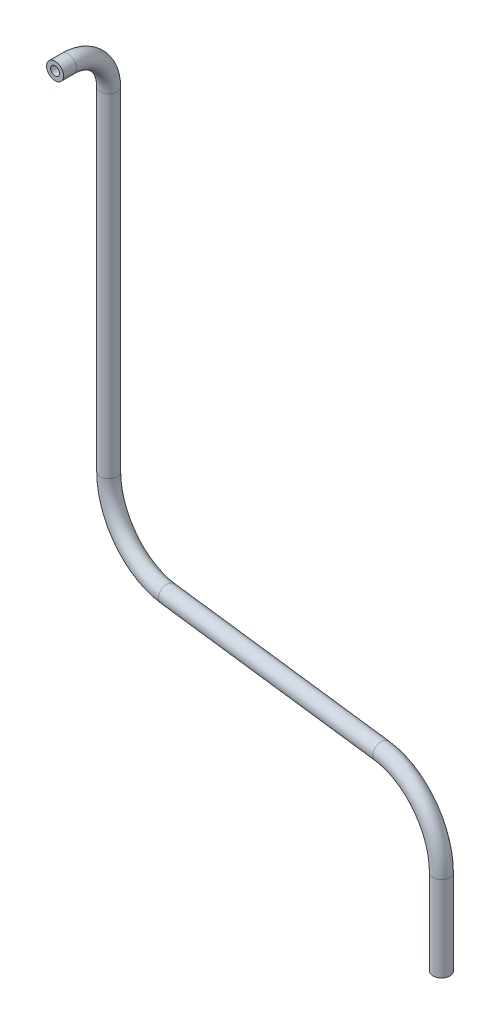
ISO-10303-21;
HEADER;
FILE_DESCRIPTION(('STEP AP214'),'2;1');
FILE_NAME('part.step','',(''),(''),'','','');
FILE_SCHEMA(('AUTOMOTIVE_DESIGN { 1 0 10303 214 1 1 1 1 }'));
ENDSEC;
DATA;
#1=APPLICATION_CONTEXT('core data for automotive mechanical design processes');
#2=APPLICATION_PROTOCOL_DEFINITION('international standard','automotive_design',2000,#1);
#3=PRODUCT_CONTEXT('',#1,'mechanical');
#4=PRODUCT('Part','Part','',(#3));
#5=PRODUCT_RELATED_PRODUCT_CATEGORY('part','',(#4));
#6=PRODUCT_DEFINITION_FORMATION('','',#4);
#7=PRODUCT_DEFINITION_CONTEXT('part definition',#1,'design');
#8=PRODUCT_DEFINITION('design','',#6,#7);
#9=PRODUCT_DEFINITION_SHAPE('','',#8);
#10=(LENGTH_UNIT() NAMED_UNIT(*) SI_UNIT(.MILLI.,.METRE.));
#11=(NAMED_UNIT(*) PLANE_ANGLE_UNIT() SI_UNIT($,.RADIAN.));
#12=(NAMED_UNIT(*) SI_UNIT($,.STERADIAN.) SOLID_ANGLE_UNIT());
#13=UNCERTAINTY_MEASURE_WITH_UNIT(LENGTH_MEASURE(1.E-05),#10,'distance_accuracy_value','');
#14=(GEOMETRIC_REPRESENTATION_CONTEXT(3) GLOBAL_UNCERTAINTY_ASSIGNED_CONTEXT((#13)) GLOBAL_UNIT_ASSIGNED_CONTEXT((#10,
#11,#12)) REPRESENTATION_CONTEXT('',''));
#15=CARTESIAN_POINT('',(0.,0.,0.));
#16=DIRECTION('',(0.,0.,1.));
#17=DIRECTION('',(1.,0.,0.));
#18=AXIS2_PLACEMENT_3D('',#15,#16,#17);
#19=CARTESIAN_POINT('',(-176.747376490412,-32.6055777684496,84.0470488537616));
#20=DIRECTION('',(0.,1.,0.));
#21=DIRECTION('',(0.,0.,1.));
#22=AXIS2_PLACEMENT_3D('',#19,#20,#21);
#23=CYLINDRICAL_SURFACE('',#22,3.175);
#24=CARTESIAN_POINT('',(-176.747376490412,-0.667291642099263,84.0470488537616));
#25=DIRECTION('',(0.,1.,0.));
#26=DIRECTION('',(0.,0.,1.));
#27=AXIS2_PLACEMENT_3D('',#24,#25,#26);
#28=CIRCLE('',#27,3.175);
#29=CARTESIAN_POINT('',(-173.594970054303,-0.667291642099263,84.4251475995619));
#30=VERTEX_POINT('',#29);
#31=EDGE_CURVE('E56',#30,#30,#28,.T.);
#32=ORIENTED_EDGE('',*,*,#31,.F.);
#33=EDGE_LOOP('',(#32));
#34=FACE_BOUND('',#33,.T.);
#35=CARTESIAN_POINT('',(-176.747376490412,-32.6055777684496,84.0470488537616));
#36=DIRECTION('',(0.,1.,0.));
#37=DIRECTION('',(0.,0.,1.));
#38=AXIS2_PLACEMENT_3D('',#35,#36,#37);
#39=CIRCLE('',#38,3.175);
#40=CARTESIAN_POINT('',(-176.747376490412,-32.6055777684496,87.2220488537616));
#41=VERTEX_POINT('',#40);
#42=EDGE_CURVE('E53',#41,#41,#39,.T.);
#43=ORIENTED_EDGE('',*,*,#42,.T.);
#44=EDGE_LOOP('',(#43));
#45=FACE_BOUND('',#44,.T.);
#46=ADVANCED_FACE('F32',(#34,#45),#23,.T.);
#47=CARTESIAN_POINT('',(-201.966627979288,-0.667291642099263,81.0222588873598));
#48=DIRECTION('',(-0.119086219149678,0.,0.992883916884867));
#49=DIRECTION('',(0.992883916884867,0.,0.119086219149678));
#50=AXIS2_PLACEMENT_3D('',#47,#48,#49);
#51=TOROIDAL_SURFACE('',#50,25.4,3.175);
#52=CARTESIAN_POINT('',(-201.966627979288,24.7327083579008,81.0222588873598));
#53=DIRECTION('',(-0.992883916884867,0.,-0.119086219149678));
#54=DIRECTION('',(-0.118238791716342,0.119086219149678,0.985818472408635));
#55=AXIS2_PLACEMENT_3D('',#52,#53,#54);
#56=CIRCLE('',#55,3.175);
#57=CARTESIAN_POINT('',(-201.966627979288,27.9077083579007,81.0222588873598));
#58=VERTEX_POINT('',#57);
#59=EDGE_CURVE('E59',#58,#58,#56,.T.);
#60=CARTESIAN_POINT('',(-201.966627979288,-0.667291642099263,81.0222588873598));
#61=DIRECTION('',(-0.119086219149678,0.,0.992883916884867));
#62=DIRECTION('',(0.992883916884867,0.,0.119086219149678));
#63=AXIS2_PLACEMENT_3D('',#60,#61,#62);
#64=CIRCLE('',#63,28.575);
#65=EDGE_CURVE('',#30,#58,#64,.T.);
#66=ORIENTED_EDGE('',*,*,#31,.T.);
#67=ORIENTED_EDGE('',*,*,#59,.F.);
#68=ORIENTED_EDGE('',*,*,#65,.T.);
#69=ORIENTED_EDGE('',*,*,#65,.F.);
#70=EDGE_LOOP('',(#66,#68,#67,#69));
#71=FACE_BOUND('',#70,.T.);
#72=ADVANCED_FACE('F110',(#71),#51,.T.);
#73=CARTESIAN_POINT('',(-201.966627979288,24.7327083579008,81.0222588873598));
#74=DIRECTION('',(-0.992883916884867,0.,-0.119086219149678));
#75=DIRECTION('',(-0.119086219149678,0.,0.992883916884867));
#76=AXIS2_PLACEMENT_3D('',#73,#74,#75);
#77=CYLINDRICAL_SURFACE('',#76,3.175);
#78=CARTESIAN_POINT('',(-293.244125001536,24.7327083579007,70.0744614369495));
#79=DIRECTION('',(-0.992883916884867,0.,-0.119086219149678));
#80=DIRECTION('',(-0.118238791716342,0.119086219149678,0.985818472408635));
#81=AXIS2_PLACEMENT_3D('',#78,#79,#80);
#82=CIRCLE('',#81,3.175);
#83=CARTESIAN_POINT('',(-293.244125001536,21.5577083579007,70.0744614369495));
#84=VERTEX_POINT('',#83);
#85=EDGE_CURVE('E62',#84,#84,#82,.T.);
#86=ORIENTED_EDGE('',*,*,#85,.F.);
#87=EDGE_LOOP('',(#86));
#88=FACE_BOUND('',#87,.T.);
#89=ORIENTED_EDGE('',*,*,#59,.T.);
#90=EDGE_LOOP('',(#89));
#91=FACE_BOUND('',#90,.T.);
#92=ADVANCED_FACE('F114',(#88,#91),#77,.T.);
#93=CARTESIAN_POINT('',(-293.244125001536,50.1327083579007,70.0744614369496));
#94=DIRECTION('',(0.119086219149678,0.,-0.992883916884867));
#95=DIRECTION('',(-0.992883916884867,0.,-0.119086219149678));
#96=AXIS2_PLACEMENT_3D('',#93,#94,#95);
#97=TOROIDAL_SURFACE('',#96,25.4,3.175);
#98=CARTESIAN_POINT('',(-318.463376490412,50.1327083579008,67.0496714705474));
#99=DIRECTION('',(0.,1.,0.));
#100=DIRECTION('',(0.,0.,1.));
#101=AXIS2_PLACEMENT_3D('',#98,#99,#100);
#102=CIRCLE('',#101,3.175);
#103=CARTESIAN_POINT('',(-321.615782926521,50.1327083579008,66.6715727247472));
#104=VERTEX_POINT('',#103);
#105=EDGE_CURVE('E65',#104,#104,#102,.T.);
#106=CARTESIAN_POINT('',(-293.244125001536,50.1327083579007,70.0744614369496));
#107=DIRECTION('',(0.119086219149678,0.,-0.992883916884867));
#108=DIRECTION('',(-0.992883916884867,0.,-0.119086219149678));
#109=AXIS2_PLACEMENT_3D('',#106,#107,#108);
#110=CIRCLE('',#109,28.575);
#111=EDGE_CURVE('',#84,#104,#110,.T.);
#112=ORIENTED_EDGE('',*,*,#85,.T.);
#113=ORIENTED_EDGE('',*,*,#105,.F.);
#114=ORIENTED_EDGE('',*,*,#111,.T.);
#115=ORIENTED_EDGE('',*,*,#111,.F.);
#116=EDGE_LOOP('',(#112,#114,#113,#115));
#117=FACE_BOUND('',#116,.T.);
#118=ADVANCED_FACE('F84',(#117),#97,.T.);
#119=CARTESIAN_POINT('',(-318.463376490412,50.1327083579009,67.0496714705474));
#120=DIRECTION('',(0.,1.,0.));
#121=DIRECTION('',(-1.,0.,0.));
#122=AXIS2_PLACEMENT_3D('',#119,#120,#121);
#123=CYLINDRICAL_SURFACE('',#122,3.175);
#124=CARTESIAN_POINT('',(-318.463376490412,175.03642223155,67.0496714705474));
#125=DIRECTION('',(0.,1.,0.));
#126=DIRECTION('',(0.,0.,1.));
#127=AXIS2_PLACEMENT_3D('',#124,#125,#126);
#128=CIRCLE('',#127,3.175);
#129=CARTESIAN_POINT('',(-318.463376490412,175.03642223155,63.8746714705474));
#130=VERTEX_POINT('',#129);
#131=EDGE_CURVE('E67',#130,#130,#128,.T.);
#132=ORIENTED_EDGE('',*,*,#131,.F.);
#133=EDGE_LOOP('',(#132));
#134=FACE_BOUND('',#133,.T.);
#135=ORIENTED_EDGE('',*,*,#105,.T.);
#136=EDGE_LOOP('',(#135));
#137=FACE_BOUND('',#136,.T.);
#138=ADVANCED_FACE('F77',(#134,#137),#123,.T.);
#139=CARTESIAN_POINT('',(-318.463376490412,175.03642223155,82.2896714705478));
#140=DIRECTION('',(1.,0.,0.));
#141=DIRECTION('',(0.,0.,-1.));
#142=AXIS2_PLACEMENT_3D('',#139,#140,#141);
#143=TOROIDAL_SURFACE('',#142,15.2400000000004,3.175);
#144=CARTESIAN_POINT('',(-318.463376490412,190.27642223155,82.2896714705478));
#145=DIRECTION('',(0.,0.,1.));
#146=DIRECTION('',(0.,-1.,0.));
#147=AXIS2_PLACEMENT_3D('',#144,#145,#146);
#148=CIRCLE('',#147,3.175);
#149=CARTESIAN_POINT('',(-318.463376490412,193.451422231551,82.2896714705478));
#150=VERTEX_POINT('',#149);
#151=EDGE_CURVE('E36',#150,#150,#148,.T.);
#152=CARTESIAN_POINT('',(-318.463376490412,175.03642223155,82.2896714705478));
#153=DIRECTION('',(1.,0.,0.));
#154=DIRECTION('',(0.,0.,-1.));
#155=AXIS2_PLACEMENT_3D('',#152,#153,#154);
#156=CIRCLE('',#155,18.4150000000004);
#157=EDGE_CURVE('',#130,#150,#156,.T.);
#158=ORIENTED_EDGE('',*,*,#131,.T.);
#159=ORIENTED_EDGE('',*,*,#151,.F.);
#160=ORIENTED_EDGE('',*,*,#157,.T.);
#161=ORIENTED_EDGE('',*,*,#157,.F.);
#162=EDGE_LOOP('',(#158,#160,#159,#161));
#163=FACE_BOUND('',#162,.T.);
#164=ADVANCED_FACE('F75',(#163),#143,.T.);
#165=CARTESIAN_POINT('',(-318.463376490412,190.27642223155,82.2896714705478));
#166=DIRECTION('',(0.,0.,1.));
#167=DIRECTION('',(1.,0.,0.));
#168=AXIS2_PLACEMENT_3D('',#165,#166,#167);
#169=CYLINDRICAL_SURFACE('',#168,3.175);
#170=CARTESIAN_POINT('',(-318.463376490412,190.27642223155,87.1470488537625));
#171=DIRECTION('',(0.,0.,1.));
#172=DIRECTION('',(0.,-1.,0.));
#173=AXIS2_PLACEMENT_3D('',#170,#171,#172);
#174=CIRCLE('',#173,3.175);
#175=CARTESIAN_POINT('',(-318.463376490412,187.10142223155,87.1470488537625));
#176=VERTEX_POINT('',#175);
#177=EDGE_CURVE('E49',#176,#176,#174,.T.);
#178=ORIENTED_EDGE('',*,*,#177,.F.);
#179=EDGE_LOOP('',(#178));
#180=FACE_BOUND('',#179,.T.);
#181=ORIENTED_EDGE('',*,*,#151,.T.);
#182=EDGE_LOOP('',(#181));
#183=FACE_BOUND('',#182,.T.);
#184=ADVANCED_FACE('F34',(#180,#183),#169,.T.);
#185=CARTESIAN_POINT('',(-176.747376490412,-32.6055777684496,84.0470488537616));
#186=DIRECTION('',(0.,1.,0.));
#187=DIRECTION('',(0.,0.,1.));
#188=AXIS2_PLACEMENT_3D('',#185,#186,#187);
#189=PLANE('',#188);
#190=CARTESIAN_POINT('',(-176.747376490412,-32.6055777684496,84.0470488537616));
#191=DIRECTION('',(0.,1.,0.));
#192=DIRECTION('',(0.,0.,1.));
#193=AXIS2_PLACEMENT_3D('',#190,#191,#192);
#194=CIRCLE('',#193,1.67449763501505);
#195=CARTESIAN_POINT('',(-176.747376490412,-32.6055777684496,85.7215464887767));
#196=VERTEX_POINT('',#195);
#197=EDGE_CURVE('E52',#196,#196,#194,.F.);
#198=ORIENTED_EDGE('',*,*,#197,.F.);
#199=EDGE_LOOP('',(#198));
#200=FACE_BOUND('',#199,.T.);
#201=ORIENTED_EDGE('',*,*,#42,.F.);
#202=EDGE_LOOP('',(#201));
#203=FACE_BOUND('',#202,.T.);
#204=ADVANCED_FACE('F82',(#200,#203),#189,.F.);
#205=CARTESIAN_POINT('',(-318.463376490412,190.27642223155,87.1470488537625));
#206=DIRECTION('',(0.,0.,1.));
#207=DIRECTION('',(0.,-1.,0.));
#208=AXIS2_PLACEMENT_3D('',#205,#206,#207);
#209=PLANE('',#208);
#210=CARTESIAN_POINT('',(-318.463376490412,190.27642223155,87.1470488537625));
#211=DIRECTION('',(0.,0.,1.));
#212=DIRECTION('',(0.,-1.,0.));
#213=AXIS2_PLACEMENT_3D('',#210,#211,#212);
#214=CIRCLE('',#213,1.67449763501505);
#215=CARTESIAN_POINT('',(-318.463376490412,188.601924596535,87.1470488537625));
#216=VERTEX_POINT('',#215);
#217=EDGE_CURVE('E10',#216,#216,#214,.F.);
#218=ORIENTED_EDGE('',*,*,#217,.T.);
#219=EDGE_LOOP('',(#218));
#220=FACE_BOUND('',#219,.T.);
#221=ORIENTED_EDGE('',*,*,#177,.T.);
#222=EDGE_LOOP('',(#221));
#223=FACE_BOUND('',#222,.T.);
#224=ADVANCED_FACE('F101',(#220,#223),#209,.T.);
#225=CARTESIAN_POINT('',(-176.747376490412,-32.6055777684496,84.0470488537616));
#226=DIRECTION('',(0.,1.,0.));
#227=DIRECTION('',(0.,0.,1.));
#228=AXIS2_PLACEMENT_3D('',#225,#226,#227);
#229=CYLINDRICAL_SURFACE('',#228,1.67449763501505);
#230=CARTESIAN_POINT('',(-176.747376490412,-0.667291642099263,84.0470488537616));
#231=DIRECTION('',(0.,1.,0.));
#232=DIRECTION('',(0.,0.,1.));
#233=AXIS2_PLACEMENT_3D('',#230,#231,#232);
#234=CIRCLE('',#233,1.67449763501505);
#235=CARTESIAN_POINT('',(-175.084794719744,-0.667291642099263,84.2464584460906));
#236=VERTEX_POINT('',#235);
#237=EDGE_CURVE('E237',#236,#236,#234,.F.);
#238=ORIENTED_EDGE('',*,*,#237,.F.);
#239=EDGE_LOOP('',(#238));
#240=FACE_BOUND('',#239,.T.);
#241=ORIENTED_EDGE('',*,*,#197,.T.);
#242=EDGE_LOOP('',(#241));
#243=FACE_BOUND('',#242,.T.);
#244=ADVANCED_FACE('F104',(#240,#243),#229,.F.);
#245=CARTESIAN_POINT('',(-201.966627979288,-0.667291642099263,81.0222588873598));
#246=DIRECTION('',(-0.119086219149678,0.,0.992883916884867));
#247=DIRECTION('',(0.992883916884867,0.,0.119086219149678));
#248=AXIS2_PLACEMENT_3D('',#245,#246,#247);
#249=TOROIDAL_SURFACE('',#248,25.4,1.67449763501505);
#250=CARTESIAN_POINT('',(-201.966627979288,24.7327083579008,81.0222588873598));
#251=DIRECTION('',(-0.992883916884867,0.,-0.119086219149678));
#252=DIRECTION('',(-0.118238791716342,0.119086219149678,0.985818472408635));
#253=AXIS2_PLACEMENT_3D('',#250,#251,#252);
#254=CIRCLE('',#253,1.67449763501505);
#255=CARTESIAN_POINT('',(-201.966627979288,26.4072059929157,81.0222588873598));
#256=VERTEX_POINT('',#255);
#257=EDGE_CURVE('E232',#256,#256,#254,.F.);
#258=CARTESIAN_POINT('',(-201.966627979288,-0.667291642099263,81.0222588873598));
#259=DIRECTION('',(-0.119086219149678,0.,0.992883916884867));
#260=DIRECTION('',(0.992883916884867,0.,0.119086219149678));
#261=AXIS2_PLACEMENT_3D('',#258,#259,#260);
#262=CIRCLE('',#261,27.074497635015);
#263=EDGE_CURVE('',#236,#256,#262,.T.);
#264=ORIENTED_EDGE('',*,*,#237,.T.);
#265=ORIENTED_EDGE('',*,*,#257,.F.);
#266=ORIENTED_EDGE('',*,*,#263,.T.);
#267=ORIENTED_EDGE('',*,*,#263,.F.);
#268=EDGE_LOOP('',(#264,#266,#265,#267));
#269=FACE_BOUND('',#268,.T.);
#270=ADVANCED_FACE('F171',(#269),#249,.F.);
#271=CARTESIAN_POINT('',(-201.966627979288,24.7327083579008,81.0222588873598));
#272=DIRECTION('',(-0.992883916884867,0.,-0.119086219149678));
#273=DIRECTION('',(-0.119086219149678,0.,0.992883916884867));
#274=AXIS2_PLACEMENT_3D('',#271,#272,#273);
#275=CYLINDRICAL_SURFACE('',#274,1.67449763501505);
#276=CARTESIAN_POINT('',(-293.244125001536,24.7327083579007,70.0744614369495));
#277=DIRECTION('',(-0.992883916884867,0.,-0.119086219149678));
#278=DIRECTION('',(-0.118238791716342,0.119086219149678,0.985818472408635));
#279=AXIS2_PLACEMENT_3D('',#276,#277,#278);
#280=CIRCLE('',#279,1.67449763501505);
#281=CARTESIAN_POINT('',(-293.244125001536,23.0582107228857,70.0744614369495));
#282=VERTEX_POINT('',#281);
#283=EDGE_CURVE('E229',#282,#282,#280,.F.);
#284=ORIENTED_EDGE('',*,*,#283,.F.);
#285=EDGE_LOOP('',(#284));
#286=FACE_BOUND('',#285,.T.);
#287=ORIENTED_EDGE('',*,*,#257,.T.);
#288=EDGE_LOOP('',(#287));
#289=FACE_BOUND('',#288,.T.);
#290=ADVANCED_FACE('F181',(#286,#289),#275,.F.);
#291=CARTESIAN_POINT('',(-293.244125001536,50.1327083579007,70.0744614369496));
#292=DIRECTION('',(0.119086219149678,0.,-0.992883916884867));
#293=DIRECTION('',(-0.992883916884867,0.,-0.119086219149678));
#294=AXIS2_PLACEMENT_3D('',#291,#292,#293);
#295=TOROIDAL_SURFACE('',#294,25.4,1.67449763501505);
#296=CARTESIAN_POINT('',(-318.463376490412,50.1327083579008,67.0496714705474));
#297=DIRECTION('',(0.,1.,0.));
#298=DIRECTION('',(0.,0.,1.));
#299=AXIS2_PLACEMENT_3D('',#296,#297,#298);
#300=CIRCLE('',#299,1.67449763501505);
#301=CARTESIAN_POINT('',(-320.12595826108,50.1327083579008,66.8502618782184));
#302=VERTEX_POINT('',#301);
#303=EDGE_CURVE('E228',#302,#302,#300,.F.);
#304=CARTESIAN_POINT('',(-293.244125001536,50.1327083579007,70.0744614369496));
#305=DIRECTION('',(0.119086219149678,0.,-0.992883916884867));
#306=DIRECTION('',(-0.992883916884867,0.,-0.119086219149678));
#307=AXIS2_PLACEMENT_3D('',#304,#305,#306);
#308=CIRCLE('',#307,27.074497635015);
#309=EDGE_CURVE('',#282,#302,#308,.T.);
#310=ORIENTED_EDGE('',*,*,#283,.T.);
#311=ORIENTED_EDGE('',*,*,#303,.F.);
#312=ORIENTED_EDGE('',*,*,#309,.T.);
#313=ORIENTED_EDGE('',*,*,#309,.F.);
#314=EDGE_LOOP('',(#310,#312,#311,#313));
#315=FACE_BOUND('',#314,.T.);
#316=ADVANCED_FACE('F191',(#315),#295,.F.);
#317=CARTESIAN_POINT('',(-318.463376490412,50.1327083579009,67.0496714705474));
#318=DIRECTION('',(0.,1.,0.));
#319=DIRECTION('',(-1.,0.,0.));
#320=AXIS2_PLACEMENT_3D('',#317,#318,#319);
#321=CYLINDRICAL_SURFACE('',#320,1.67449763501505);
#322=CARTESIAN_POINT('',(-318.463376490412,175.03642223155,67.0496714705474));
#323=DIRECTION('',(0.,1.,0.));
#324=DIRECTION('',(0.,0.,1.));
#325=AXIS2_PLACEMENT_3D('',#322,#323,#324);
#326=CIRCLE('',#325,1.67449763501505);
#327=CARTESIAN_POINT('',(-318.463376490412,175.03642223155,65.3751738355324));
#328=VERTEX_POINT('',#327);
#329=EDGE_CURVE('E45',#328,#328,#326,.F.);
#330=ORIENTED_EDGE('',*,*,#329,.F.);
#331=EDGE_LOOP('',(#330));
#332=FACE_BOUND('',#331,.T.);
#333=ORIENTED_EDGE('',*,*,#303,.T.);
#334=EDGE_LOOP('',(#333));
#335=FACE_BOUND('',#334,.T.);
#336=ADVANCED_FACE('F95',(#332,#335),#321,.F.);
#337=CARTESIAN_POINT('',(-318.463376490412,175.03642223155,82.2896714705478));
#338=DIRECTION('',(1.,0.,0.));
#339=DIRECTION('',(0.,0.,-1.));
#340=AXIS2_PLACEMENT_3D('',#337,#338,#339);
#341=TOROIDAL_SURFACE('',#340,15.2400000000004,1.67449763501505);
#342=CARTESIAN_POINT('',(-318.463376490412,190.27642223155,82.2896714705478));
#343=DIRECTION('',(0.,0.,1.));
#344=DIRECTION('',(0.,-1.,0.));
#345=AXIS2_PLACEMENT_3D('',#342,#343,#344);
#346=CIRCLE('',#345,1.67449763501505);
#347=CARTESIAN_POINT('',(-318.463376490412,191.950919866566,82.2896714705478));
#348=VERTEX_POINT('',#347);
#349=EDGE_CURVE('E40',#348,#348,#346,.F.);
#350=CARTESIAN_POINT('',(-318.463376490412,175.03642223155,82.2896714705478));
#351=DIRECTION('',(1.,0.,0.));
#352=DIRECTION('',(0.,0.,-1.));
#353=AXIS2_PLACEMENT_3D('',#350,#351,#352);
#354=CIRCLE('',#353,16.9144976350154);
#355=EDGE_CURVE('',#328,#348,#354,.T.);
#356=ORIENTED_EDGE('',*,*,#329,.T.);
#357=ORIENTED_EDGE('',*,*,#349,.F.);
#358=ORIENTED_EDGE('',*,*,#355,.T.);
#359=ORIENTED_EDGE('',*,*,#355,.F.);
#360=EDGE_LOOP('',(#356,#358,#357,#359));
#361=FACE_BOUND('',#360,.T.);
#362=ADVANCED_FACE('F89',(#361),#341,.F.);
#363=CARTESIAN_POINT('',(-318.463376490412,190.27642223155,82.2896714705478));
#364=DIRECTION('',(0.,0.,1.));
#365=DIRECTION('',(1.,0.,0.));
#366=AXIS2_PLACEMENT_3D('',#363,#364,#365);
#367=CYLINDRICAL_SURFACE('',#366,1.67449763501505);
#368=ORIENTED_EDGE('',*,*,#217,.F.);
#369=EDGE_LOOP('',(#368));
#370=FACE_BOUND('',#369,.T.);
#371=ORIENTED_EDGE('',*,*,#349,.T.);
#372=EDGE_LOOP('',(#371));
#373=FACE_BOUND('',#372,.T.);
#374=ADVANCED_FACE('F87',(#370,#373),#367,.F.);
#375=CLOSED_SHELL('',(#46,#72,#92,#118,#138,#164,#184,#204,#224,#244,#270,#290,#316,#336,#362,#374));
#376=MANIFOLD_SOLID_BREP('B2',#375);
#377=ADVANCED_BREP_SHAPE_REPRESENTATION('',(#18,#376),#14);
#378=SHAPE_DEFINITION_REPRESENTATION(#9,#377);
ENDSEC;
END-ISO-10303-21;
